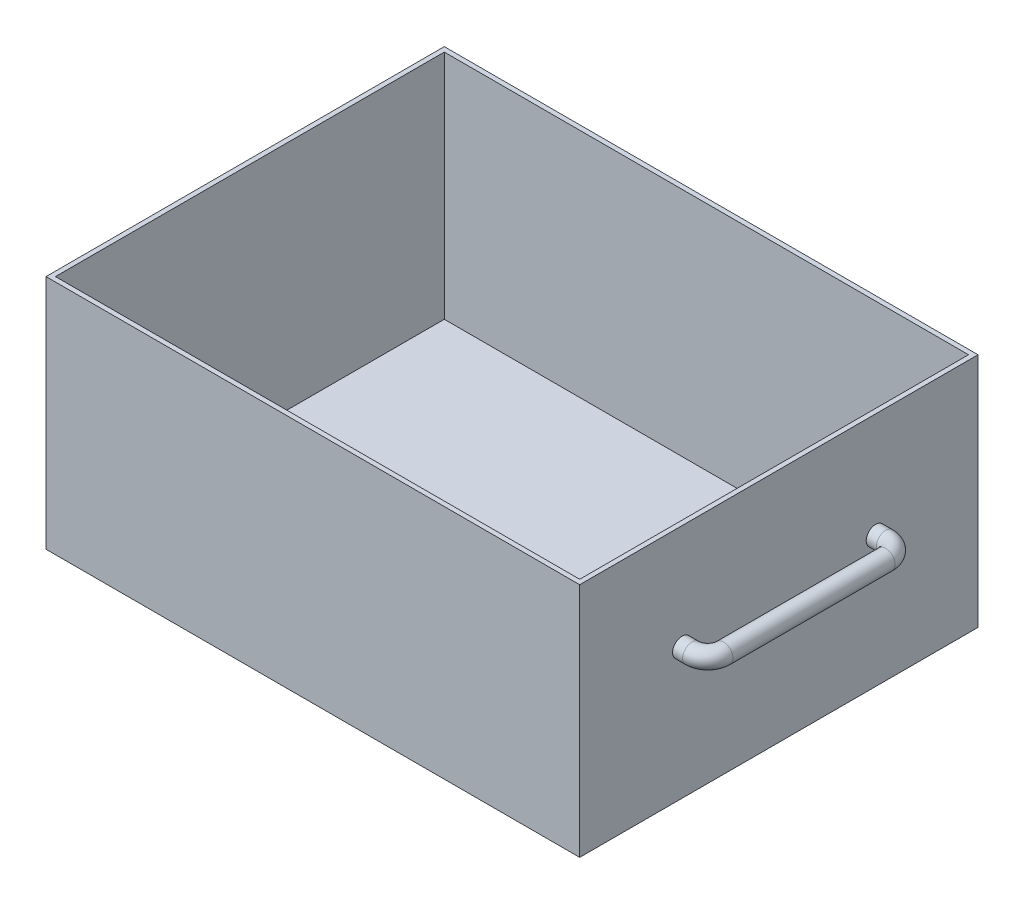
ISO-10303-21;
HEADER;
FILE_DESCRIPTION(('STEP AP214'),'2;1');
FILE_NAME('part.step','',(''),(''),'','','');
FILE_SCHEMA(('AUTOMOTIVE_DESIGN { 1 0 10303 214 1 1 1 1 }'));
ENDSEC;
DATA;
#1=APPLICATION_CONTEXT('core data for automotive mechanical design processes');
#2=APPLICATION_PROTOCOL_DEFINITION('international standard','automotive_design',2000,#1);
#3=PRODUCT_CONTEXT('',#1,'mechanical');
#4=PRODUCT('Part','Part','',(#3));
#5=PRODUCT_RELATED_PRODUCT_CATEGORY('part','',(#4));
#6=PRODUCT_DEFINITION_FORMATION('','',#4);
#7=PRODUCT_DEFINITION_CONTEXT('part definition',#1,'design');
#8=PRODUCT_DEFINITION('design','',#6,#7);
#9=PRODUCT_DEFINITION_SHAPE('','',#8);
#10=(LENGTH_UNIT() NAMED_UNIT(*) SI_UNIT(.MILLI.,.METRE.));
#11=(NAMED_UNIT(*) PLANE_ANGLE_UNIT() SI_UNIT($,.RADIAN.));
#12=(NAMED_UNIT(*) SI_UNIT($,.STERADIAN.) SOLID_ANGLE_UNIT());
#13=UNCERTAINTY_MEASURE_WITH_UNIT(LENGTH_MEASURE(1.E-05),#10,'distance_accuracy_value','');
#14=(GEOMETRIC_REPRESENTATION_CONTEXT(3) GLOBAL_UNCERTAINTY_ASSIGNED_CONTEXT((#13)) GLOBAL_UNIT_ASSIGNED_CONTEXT((#10,
#11,#12)) REPRESENTATION_CONTEXT('',''));
#15=CARTESIAN_POINT('',(0.,0.,0.));
#16=DIRECTION('',(0.,0.,1.));
#17=DIRECTION('',(1.,0.,0.));
#18=AXIS2_PLACEMENT_3D('',#15,#16,#17);
#19=CARTESIAN_POINT('',(163.179916317992,150.,-119.874476987448));
#20=DIRECTION('',(-1.,0.,0.));
#21=DIRECTION('',(0.,0.,1.));
#22=AXIS2_PLACEMENT_3D('',#19,#20,#21);
#23=PLANE('',#22);
#24=DIRECTION('',(0.,0.,-1.));
#25=VECTOR('',#24,1.);
#26=CARTESIAN_POINT('',(163.179916317992,0.,-119.874476987448));
#27=LINE('',#26,#25);
#28=CARTESIAN_POINT('',(163.179916317992,0.,133.125523012552));
#29=VERTEX_POINT('',#28);
#30=CARTESIAN_POINT('',(163.179916317992,0.,-119.874476987448));
#31=VERTEX_POINT('',#30);
#32=EDGE_CURVE('E155',#29,#31,#27,.T.);
#33=ORIENTED_EDGE('',*,*,#32,.T.);
#34=DIRECTION('',(0.,-1.,0.));
#35=VECTOR('',#34,1.);
#36=CARTESIAN_POINT('',(163.179916317992,150.,-119.874476987448));
#37=LINE('',#36,#35);
#38=CARTESIAN_POINT('',(163.179916317992,150.,-119.874476987448));
#39=VERTEX_POINT('',#38);
#40=EDGE_CURVE('E159',#39,#31,#37,.T.);
#41=ORIENTED_EDGE('',*,*,#40,.F.);
#42=DIRECTION('',(0.,0.,-1.));
#43=VECTOR('',#42,1.);
#44=CARTESIAN_POINT('',(163.179916317992,150.,-119.874476987448));
#45=LINE('',#44,#43);
#46=CARTESIAN_POINT('',(163.179916317992,150.,133.125523012552));
#47=VERTEX_POINT('',#46);
#48=EDGE_CURVE('E146',#47,#39,#45,.T.);
#49=ORIENTED_EDGE('',*,*,#48,.F.);
#50=DIRECTION('',(0.,-1.,0.));
#51=VECTOR('',#50,1.);
#52=CARTESIAN_POINT('',(163.179916317992,150.,133.125523012552));
#53=LINE('',#52,#51);
#54=EDGE_CURVE('E160',#47,#29,#53,.T.);
#55=ORIENTED_EDGE('',*,*,#54,.T.);
#56=EDGE_LOOP('',(#33,#41,#49,#55));
#57=FACE_BOUND('',#56,.T.);
#58=CARTESIAN_POINT('',(163.179916317992,83.1723956839028,-54.8744769874477));
#59=DIRECTION('',(-1.,0.,0.));
#60=DIRECTION('',(0.,0.,1.));
#61=AXIS2_PLACEMENT_3D('',#58,#59,#60);
#62=CIRCLE('',#61,6.00000000000001);
#63=CARTESIAN_POINT('',(163.179916317992,83.1723956839028,-48.8744769874477));
#64=VERTEX_POINT('',#63);
#65=EDGE_CURVE('E328',#64,#64,#62,.T.);
#66=ORIENTED_EDGE('',*,*,#65,.T.);
#67=EDGE_LOOP('',(#66));
#68=FACE_BOUND('',#67,.T.);
#69=CARTESIAN_POINT('',(163.179916317992,83.1723956839028,68.1255230125523));
#70=DIRECTION('',(1.,0.,0.));
#71=DIRECTION('',(0.,0.,-1.));
#72=AXIS2_PLACEMENT_3D('',#69,#70,#71);
#73=CIRCLE('',#72,6.00000000000001);
#74=CARTESIAN_POINT('',(163.179916317992,83.1723956839028,62.1255230125523));
#75=VERTEX_POINT('',#74);
#76=EDGE_CURVE('E11',#75,#75,#73,.T.);
#77=ORIENTED_EDGE('',*,*,#76,.F.);
#78=EDGE_LOOP('',(#77));
#79=FACE_BOUND('',#78,.T.);
#80=ADVANCED_FACE('F33',(#57,#68,#79),#23,.F.);
#81=CARTESIAN_POINT('',(-175.820083682009,150.,-119.874476987448));
#82=DIRECTION('',(1.,0.,0.));
#83=DIRECTION('',(0.,0.,-1.));
#84=AXIS2_PLACEMENT_3D('',#81,#82,#83);
#85=PLANE('',#84);
#86=DIRECTION('',(0.,0.,1.));
#87=VECTOR('',#86,1.);
#88=CARTESIAN_POINT('',(-175.820083682009,0.,-119.874476987448));
#89=LINE('',#88,#87);
#90=CARTESIAN_POINT('',(-175.820083682009,0.,-119.874476987448));
#91=VERTEX_POINT('',#90);
#92=CARTESIAN_POINT('',(-175.820083682009,0.,133.125523012552));
#93=VERTEX_POINT('',#92);
#94=EDGE_CURVE('E150',#91,#93,#89,.T.);
#95=ORIENTED_EDGE('',*,*,#94,.T.);
#96=DIRECTION('',(0.,-1.,0.));
#97=VECTOR('',#96,1.);
#98=CARTESIAN_POINT('',(-175.820083682009,150.,133.125523012552));
#99=LINE('',#98,#97);
#100=CARTESIAN_POINT('',(-175.820083682009,150.,133.125523012552));
#101=VERTEX_POINT('',#100);
#102=EDGE_CURVE('E37',#101,#93,#99,.T.);
#103=ORIENTED_EDGE('',*,*,#102,.F.);
#104=DIRECTION('',(0.,0.,1.));
#105=VECTOR('',#104,1.);
#106=CARTESIAN_POINT('',(-175.820083682009,150.,-119.874476987448));
#107=LINE('',#106,#105);
#108=CARTESIAN_POINT('',(-175.820083682009,150.,-119.874476987448));
#109=VERTEX_POINT('',#108);
#110=EDGE_CURVE('E143',#109,#101,#107,.T.);
#111=ORIENTED_EDGE('',*,*,#110,.F.);
#112=DIRECTION('',(0.,-1.,0.));
#113=VECTOR('',#112,1.);
#114=CARTESIAN_POINT('',(-175.820083682009,150.,-119.874476987448));
#115=LINE('',#114,#113);
#116=EDGE_CURVE('E149',#109,#91,#115,.T.);
#117=ORIENTED_EDGE('',*,*,#116,.T.);
#118=EDGE_LOOP('',(#95,#103,#111,#117));
#119=FACE_BOUND('',#118,.T.);
#120=ADVANCED_FACE('F35',(#119),#85,.F.);
#121=CARTESIAN_POINT('',(-175.820083682009,150.,133.125523012552));
#122=DIRECTION('',(0.,0.,-1.));
#123=DIRECTION('',(-1.,0.,0.));
#124=AXIS2_PLACEMENT_3D('',#121,#122,#123);
#125=PLANE('',#124);
#126=DIRECTION('',(1.,0.,0.));
#127=VECTOR('',#126,1.);
#128=CARTESIAN_POINT('',(-175.820083682009,0.,133.125523012552));
#129=LINE('',#128,#127);
#130=EDGE_CURVE('E153',#93,#29,#129,.T.);
#131=ORIENTED_EDGE('',*,*,#130,.T.);
#132=ORIENTED_EDGE('',*,*,#54,.F.);
#133=DIRECTION('',(1.,0.,0.));
#134=VECTOR('',#133,1.);
#135=CARTESIAN_POINT('',(-175.820083682009,150.,133.125523012552));
#136=LINE('',#135,#134);
#137=EDGE_CURVE('E87',#101,#47,#136,.T.);
#138=ORIENTED_EDGE('',*,*,#137,.F.);
#139=ORIENTED_EDGE('',*,*,#102,.T.);
#140=EDGE_LOOP('',(#131,#132,#138,#139));
#141=FACE_BOUND('',#140,.T.);
#142=ADVANCED_FACE('F166',(#141),#125,.F.);
#143=CARTESIAN_POINT('',(-175.820083682009,150.,-119.874476987448));
#144=DIRECTION('',(0.,0.,1.));
#145=DIRECTION('',(1.,0.,0.));
#146=AXIS2_PLACEMENT_3D('',#143,#144,#145);
#147=PLANE('',#146);
#148=DIRECTION('',(-1.,0.,0.));
#149=VECTOR('',#148,1.);
#150=CARTESIAN_POINT('',(-175.820083682009,0.,-119.874476987448));
#151=LINE('',#150,#149);
#152=EDGE_CURVE('E79',#31,#91,#151,.T.);
#153=ORIENTED_EDGE('',*,*,#152,.T.);
#154=ORIENTED_EDGE('',*,*,#116,.F.);
#155=DIRECTION('',(-1.,0.,0.));
#156=VECTOR('',#155,1.);
#157=CARTESIAN_POINT('',(-175.820083682009,150.,-119.874476987448));
#158=LINE('',#157,#156);
#159=EDGE_CURVE('E58',#39,#109,#158,.T.);
#160=ORIENTED_EDGE('',*,*,#159,.F.);
#161=ORIENTED_EDGE('',*,*,#40,.T.);
#162=EDGE_LOOP('',(#153,#154,#160,#161));
#163=FACE_BOUND('',#162,.T.);
#164=ADVANCED_FACE('F174',(#163),#147,.F.);
#165=CARTESIAN_POINT('',(0.,150.,0.));
#166=DIRECTION('',(0.,1.,0.));
#167=DIRECTION('',(0.,0.,1.));
#168=AXIS2_PLACEMENT_3D('',#165,#166,#167);
#169=PLANE('',#168);
#170=DIRECTION('',(0.,0.,1.));
#171=VECTOR('',#170,1.);
#172=CARTESIAN_POINT('',(-172.820083682009,150.,-119.874476987448));
#173=LINE('',#172,#171);
#174=CARTESIAN_POINT('',(-172.820083682009,150.,-116.874476987448));
#175=VERTEX_POINT('',#174);
#176=CARTESIAN_POINT('',(-172.820083682009,150.,130.125523012552));
#177=VERTEX_POINT('',#176);
#178=EDGE_CURVE('E132',#175,#177,#173,.T.);
#179=ORIENTED_EDGE('',*,*,#178,.F.);
#180=DIRECTION('',(-1.,0.,0.));
#181=VECTOR('',#180,1.);
#182=CARTESIAN_POINT('',(-175.820083682009,150.,-116.874476987448));
#183=LINE('',#182,#181);
#184=CARTESIAN_POINT('',(160.179916317992,150.,-116.874476987448));
#185=VERTEX_POINT('',#184);
#186=EDGE_CURVE('E141',#185,#175,#183,.T.);
#187=ORIENTED_EDGE('',*,*,#186,.F.);
#188=DIRECTION('',(0.,0.,-1.));
#189=VECTOR('',#188,1.);
#190=CARTESIAN_POINT('',(160.179916317992,150.,-119.874476987448));
#191=LINE('',#190,#189);
#192=CARTESIAN_POINT('',(160.179916317992,150.,130.125523012552));
#193=VERTEX_POINT('',#192);
#194=EDGE_CURVE('E139',#193,#185,#191,.T.);
#195=ORIENTED_EDGE('',*,*,#194,.F.);
#196=DIRECTION('',(1.,0.,0.));
#197=VECTOR('',#196,1.);
#198=CARTESIAN_POINT('',(-175.820083682009,150.,130.125523012552));
#199=LINE('',#198,#197);
#200=EDGE_CURVE('E124',#177,#193,#199,.T.);
#201=ORIENTED_EDGE('',*,*,#200,.F.);
#202=EDGE_LOOP('',(#179,#187,#195,#201));
#203=FACE_BOUND('',#202,.T.);
#204=ORIENTED_EDGE('',*,*,#110,.T.);
#205=ORIENTED_EDGE('',*,*,#137,.T.);
#206=ORIENTED_EDGE('',*,*,#48,.T.);
#207=ORIENTED_EDGE('',*,*,#159,.T.);
#208=EDGE_LOOP('',(#204,#205,#206,#207));
#209=FACE_BOUND('',#208,.T.);
#210=ADVANCED_FACE('F175',(#203,#209),#169,.T.);
#211=CARTESIAN_POINT('',(0.,0.,0.));
#212=DIRECTION('',(0.,1.,0.));
#213=DIRECTION('',(0.,0.,1.));
#214=AXIS2_PLACEMENT_3D('',#211,#212,#213);
#215=PLANE('',#214);
#216=ORIENTED_EDGE('',*,*,#94,.F.);
#217=ORIENTED_EDGE('',*,*,#152,.F.);
#218=ORIENTED_EDGE('',*,*,#32,.F.);
#219=ORIENTED_EDGE('',*,*,#130,.F.);
#220=EDGE_LOOP('',(#216,#217,#218,#219));
#221=FACE_BOUND('',#220,.T.);
#222=ADVANCED_FACE('F171',(#221),#215,.F.);
#223=CARTESIAN_POINT('',(-172.820083682009,150.,-119.874476987448));
#224=DIRECTION('',(1.,0.,0.));
#225=DIRECTION('',(0.,0.,-1.));
#226=AXIS2_PLACEMENT_3D('',#223,#224,#225);
#227=PLANE('',#226);
#228=DIRECTION('',(0.,0.,1.));
#229=VECTOR('',#228,1.);
#230=CARTESIAN_POINT('',(-172.820083682009,3.,-119.874476987448));
#231=LINE('',#230,#229);
#232=CARTESIAN_POINT('',(-172.820083682009,3.,-116.874476987448));
#233=VERTEX_POINT('',#232);
#234=CARTESIAN_POINT('',(-172.820083682009,3.,130.125523012552));
#235=VERTEX_POINT('',#234);
#236=EDGE_CURVE('E115',#233,#235,#231,.T.);
#237=ORIENTED_EDGE('',*,*,#236,.F.);
#238=DIRECTION('',(0.,-1.,0.));
#239=VECTOR('',#238,1.);
#240=CARTESIAN_POINT('',(-172.820083682009,150.,-116.874476987448));
#241=LINE('',#240,#239);
#242=EDGE_CURVE('E135',#175,#233,#241,.T.);
#243=ORIENTED_EDGE('',*,*,#242,.F.);
#244=ORIENTED_EDGE('',*,*,#178,.T.);
#245=DIRECTION('',(0.,-1.,0.));
#246=VECTOR('',#245,1.);
#247=CARTESIAN_POINT('',(-172.820083682009,150.,130.125523012552));
#248=LINE('',#247,#246);
#249=EDGE_CURVE('E127',#177,#235,#248,.T.);
#250=ORIENTED_EDGE('',*,*,#249,.T.);
#251=EDGE_LOOP('',(#237,#243,#244,#250));
#252=FACE_BOUND('',#251,.T.);
#253=ADVANCED_FACE('F183',(#252),#227,.T.);
#254=CARTESIAN_POINT('',(-175.820083682009,150.,130.125523012552));
#255=DIRECTION('',(0.,0.,-1.));
#256=DIRECTION('',(-1.,0.,0.));
#257=AXIS2_PLACEMENT_3D('',#254,#255,#256);
#258=PLANE('',#257);
#259=DIRECTION('',(1.,0.,0.));
#260=VECTOR('',#259,1.);
#261=CARTESIAN_POINT('',(-175.820083682009,3.,130.125523012552));
#262=LINE('',#261,#260);
#263=CARTESIAN_POINT('',(160.179916317992,3.,130.125523012552));
#264=VERTEX_POINT('',#263);
#265=EDGE_CURVE('E109',#235,#264,#262,.T.);
#266=ORIENTED_EDGE('',*,*,#265,.F.);
#267=ORIENTED_EDGE('',*,*,#249,.F.);
#268=ORIENTED_EDGE('',*,*,#200,.T.);
#269=DIRECTION('',(0.,-1.,0.));
#270=VECTOR('',#269,1.);
#271=CARTESIAN_POINT('',(160.179916317992,150.,130.125523012552));
#272=LINE('',#271,#270);
#273=EDGE_CURVE('E121',#193,#264,#272,.T.);
#274=ORIENTED_EDGE('',*,*,#273,.T.);
#275=EDGE_LOOP('',(#266,#267,#268,#274));
#276=FACE_BOUND('',#275,.T.);
#277=ADVANCED_FACE('F122',(#276),#258,.T.);
#278=CARTESIAN_POINT('',(160.179916317992,150.,-119.874476987448));
#279=DIRECTION('',(-1.,0.,0.));
#280=DIRECTION('',(0.,0.,1.));
#281=AXIS2_PLACEMENT_3D('',#278,#279,#280);
#282=PLANE('',#281);
#283=DIRECTION('',(0.,0.,-1.));
#284=VECTOR('',#283,1.);
#285=CARTESIAN_POINT('',(160.179916317992,3.,-119.874476987448));
#286=LINE('',#285,#284);
#287=CARTESIAN_POINT('',(160.179916317992,3.,-116.874476987448));
#288=VERTEX_POINT('',#287);
#289=EDGE_CURVE('E113',#264,#288,#286,.T.);
#290=ORIENTED_EDGE('',*,*,#289,.F.);
#291=ORIENTED_EDGE('',*,*,#273,.F.);
#292=ORIENTED_EDGE('',*,*,#194,.T.);
#293=DIRECTION('',(0.,-1.,0.));
#294=VECTOR('',#293,1.);
#295=CARTESIAN_POINT('',(160.179916317992,150.,-116.874476987448));
#296=LINE('',#295,#294);
#297=EDGE_CURVE('E49',#185,#288,#296,.T.);
#298=ORIENTED_EDGE('',*,*,#297,.T.);
#299=EDGE_LOOP('',(#290,#291,#292,#298));
#300=FACE_BOUND('',#299,.T.);
#301=ADVANCED_FACE('F129',(#300),#282,.T.);
#302=CARTESIAN_POINT('',(-175.820083682009,150.,-116.874476987448));
#303=DIRECTION('',(0.,0.,1.));
#304=DIRECTION('',(1.,0.,0.));
#305=AXIS2_PLACEMENT_3D('',#302,#303,#304);
#306=PLANE('',#305);
#307=DIRECTION('',(-1.,0.,0.));
#308=VECTOR('',#307,1.);
#309=CARTESIAN_POINT('',(-175.820083682009,3.,-116.874476987448));
#310=LINE('',#309,#308);
#311=EDGE_CURVE('E130',#288,#233,#310,.T.);
#312=ORIENTED_EDGE('',*,*,#311,.F.);
#313=ORIENTED_EDGE('',*,*,#297,.F.);
#314=ORIENTED_EDGE('',*,*,#186,.T.);
#315=ORIENTED_EDGE('',*,*,#242,.T.);
#316=EDGE_LOOP('',(#312,#313,#314,#315));
#317=FACE_BOUND('',#316,.T.);
#318=ADVANCED_FACE('F238',(#317),#306,.T.);
#319=CARTESIAN_POINT('',(0.,3.,0.));
#320=DIRECTION('',(0.,1.,0.));
#321=DIRECTION('',(0.,0.,1.));
#322=AXIS2_PLACEMENT_3D('',#319,#320,#321);
#323=PLANE('',#322);
#324=ORIENTED_EDGE('',*,*,#236,.T.);
#325=ORIENTED_EDGE('',*,*,#265,.T.);
#326=ORIENTED_EDGE('',*,*,#289,.T.);
#327=ORIENTED_EDGE('',*,*,#311,.T.);
#328=EDGE_LOOP('',(#324,#325,#326,#327));
#329=FACE_BOUND('',#328,.T.);
#330=ADVANCED_FACE('F111',(#329),#323,.T.);
#331=CARTESIAN_POINT('',(169.565605173622,83.1723956839028,-54.8744769874477));
#332=DIRECTION('',(-1.,0.,0.));
#333=DIRECTION('',(0.,0.,1.));
#334=AXIS2_PLACEMENT_3D('',#331,#332,#333);
#335=CYLINDRICAL_SURFACE('',#334,6.00000000000001);
#336=CARTESIAN_POINT('',(169.565605173622,83.1723956839028,-54.8744769874477));
#337=DIRECTION('',(-1.,0.,0.));
#338=DIRECTION('',(0.,0.,1.));
#339=AXIS2_PLACEMENT_3D('',#336,#337,#338);
#340=CIRCLE('',#339,6.00000000000001);
#341=CARTESIAN_POINT('',(169.565605173622,83.1723956839028,-60.8744769874477));
#342=VERTEX_POINT('',#341);
#343=EDGE_CURVE('E325',#342,#342,#340,.T.);
#344=ORIENTED_EDGE('',*,*,#343,.T.);
#345=EDGE_LOOP('',(#344));
#346=FACE_BOUND('',#345,.T.);
#347=ORIENTED_EDGE('',*,*,#65,.F.);
#348=EDGE_LOOP('',(#347));
#349=FACE_BOUND('',#348,.T.);
#350=ADVANCED_FACE('F254',(#346,#349),#335,.T.);
#351=CARTESIAN_POINT('',(169.565605173622,83.1723956839028,-44.8744769874477));
#352=DIRECTION('',(0.,1.,0.));
#353=DIRECTION('',(0.,0.,1.));
#354=AXIS2_PLACEMENT_3D('',#351,#352,#353);
#355=TOROIDAL_SURFACE('',#354,9.99999999999995,6.00000000000001);
#356=CARTESIAN_POINT('',(179.565605173622,83.1723956839028,-44.8744769874477));
#357=DIRECTION('',(0.,0.,-1.));
#358=DIRECTION('',(-1.,0.,0.));
#359=AXIS2_PLACEMENT_3D('',#356,#357,#358);
#360=CIRCLE('',#359,6.00000000000001);
#361=CARTESIAN_POINT('',(185.565605173622,83.1723956839028,-44.8744769874477));
#362=VERTEX_POINT('',#361);
#363=EDGE_CURVE('E320',#362,#362,#360,.T.);
#364=CARTESIAN_POINT('',(169.565605173622,83.1723956839028,-44.8744769874477));
#365=DIRECTION('',(0.,1.,0.));
#366=DIRECTION('',(0.,0.,1.));
#367=AXIS2_PLACEMENT_3D('',#364,#365,#366);
#368=CIRCLE('',#367,16.);
#369=EDGE_CURVE('',#362,#342,#368,.T.);
#370=ORIENTED_EDGE('',*,*,#363,.T.);
#371=ORIENTED_EDGE('',*,*,#343,.F.);
#372=ORIENTED_EDGE('',*,*,#369,.T.);
#373=ORIENTED_EDGE('',*,*,#369,.F.);
#374=EDGE_LOOP('',(#370,#372,#371,#373));
#375=FACE_BOUND('',#374,.T.);
#376=ADVANCED_FACE('F267',(#375),#355,.T.);
#377=CARTESIAN_POINT('',(179.565605173622,83.1723956839028,58.1255230125523));
#378=DIRECTION('',(0.,0.,-1.));
#379=DIRECTION('',(-1.,0.,0.));
#380=AXIS2_PLACEMENT_3D('',#377,#378,#379);
#381=CYLINDRICAL_SURFACE('',#380,6.00000000000001);
#382=CARTESIAN_POINT('',(179.565605173622,83.1723956839028,58.1255230125523));
#383=DIRECTION('',(0.,0.,-1.));
#384=DIRECTION('',(-1.,0.,0.));
#385=AXIS2_PLACEMENT_3D('',#382,#383,#384);
#386=CIRCLE('',#385,6.00000000000001);
#387=CARTESIAN_POINT('',(185.565605173622,83.1723956839028,58.1255230125522));
#388=VERTEX_POINT('',#387);
#389=EDGE_CURVE('E317',#388,#388,#386,.T.);
#390=ORIENTED_EDGE('',*,*,#389,.T.);
#391=EDGE_LOOP('',(#390));
#392=FACE_BOUND('',#391,.T.);
#393=ORIENTED_EDGE('',*,*,#363,.F.);
#394=EDGE_LOOP('',(#393));
#395=FACE_BOUND('',#394,.T.);
#396=ADVANCED_FACE('F277',(#392,#395),#381,.T.);
#397=CARTESIAN_POINT('',(169.565605173622,83.1723956839028,58.1255230125523));
#398=DIRECTION('',(0.,1.,0.));
#399=DIRECTION('',(0.,0.,1.));
#400=AXIS2_PLACEMENT_3D('',#397,#398,#399);
#401=TOROIDAL_SURFACE('',#400,9.99999999999999,6.00000000000001);
#402=CARTESIAN_POINT('',(169.565605173622,83.1723956839028,68.1255230125523));
#403=DIRECTION('',(1.,0.,0.));
#404=DIRECTION('',(0.,0.,-1.));
#405=AXIS2_PLACEMENT_3D('',#402,#403,#404);
#406=CIRCLE('',#405,6.00000000000001);
#407=CARTESIAN_POINT('',(169.565605173622,83.1723956839028,74.1255230125523));
#408=VERTEX_POINT('',#407);
#409=EDGE_CURVE('E314',#408,#408,#406,.T.);
#410=CARTESIAN_POINT('',(169.565605173622,83.1723956839028,58.1255230125523));
#411=DIRECTION('',(0.,1.,0.));
#412=DIRECTION('',(0.,0.,1.));
#413=AXIS2_PLACEMENT_3D('',#410,#411,#412);
#414=CIRCLE('',#413,16.);
#415=EDGE_CURVE('',#408,#388,#414,.T.);
#416=ORIENTED_EDGE('',*,*,#409,.T.);
#417=ORIENTED_EDGE('',*,*,#389,.F.);
#418=ORIENTED_EDGE('',*,*,#415,.T.);
#419=ORIENTED_EDGE('',*,*,#415,.F.);
#420=EDGE_LOOP('',(#416,#418,#417,#419));
#421=FACE_BOUND('',#420,.T.);
#422=ADVANCED_FACE('F287',(#421),#401,.T.);
#423=CARTESIAN_POINT('',(169.565605173622,83.1723956839028,68.1255230125523));
#424=DIRECTION('',(-1.,0.,0.));
#425=DIRECTION('',(0.,0.,1.));
#426=AXIS2_PLACEMENT_3D('',#423,#424,#425);
#427=CYLINDRICAL_SURFACE('',#426,6.00000000000001);
#428=ORIENTED_EDGE('',*,*,#409,.F.);
#429=EDGE_LOOP('',(#428));
#430=FACE_BOUND('',#429,.T.);
#431=ORIENTED_EDGE('',*,*,#76,.T.);
#432=EDGE_LOOP('',(#431));
#433=FACE_BOUND('',#432,.T.);
#434=ADVANCED_FACE('F297',(#430,#433),#427,.T.);
#435=CLOSED_SHELL('',(#80,#120,#142,#164,#210,#222,#253,#277,#301,#318,#330,#350,#376,#396,#422,#434));
#436=MANIFOLD_SOLID_BREP('B2',#435);
#437=ADVANCED_BREP_SHAPE_REPRESENTATION('',(#18,#436),#14);
#438=SHAPE_DEFINITION_REPRESENTATION(#9,#437);
ENDSEC;
END-ISO-10303-21;
